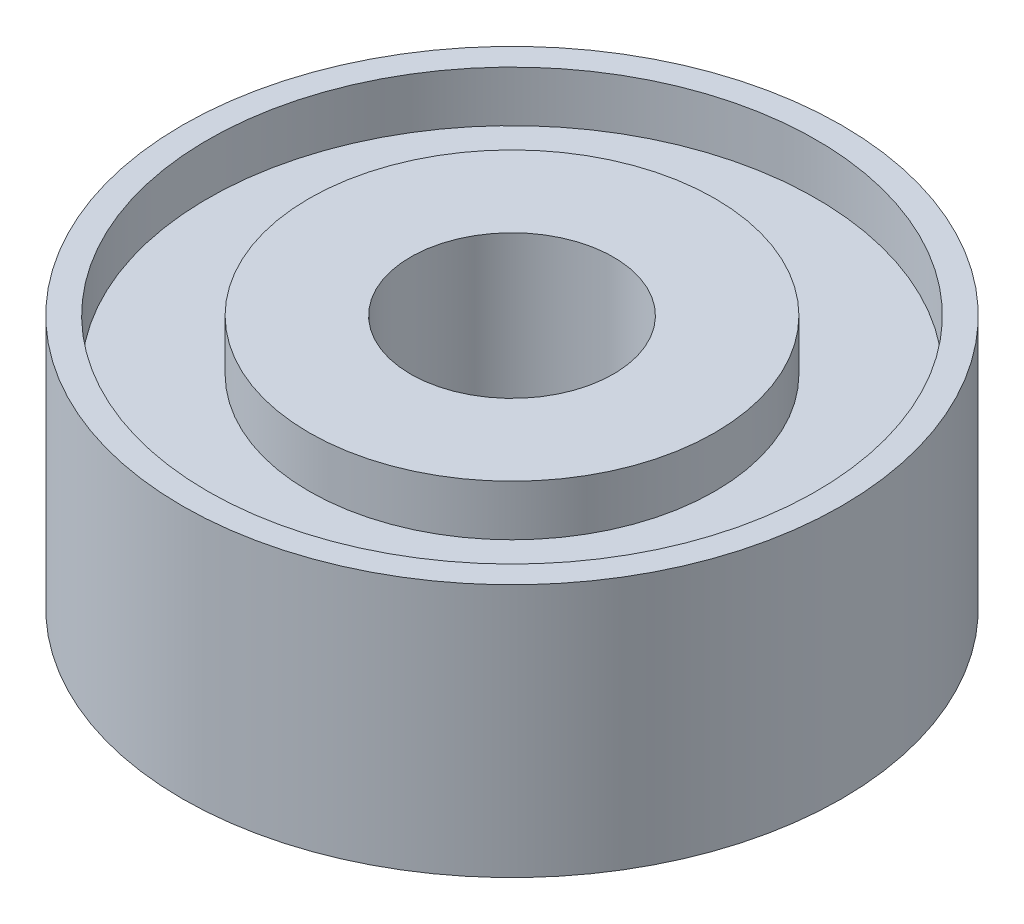
ISO-10303-21;
HEADER;
FILE_DESCRIPTION(('STEP AP214'),'2;1');
FILE_NAME('part.step','',(''),(''),'','','');
FILE_SCHEMA(('AUTOMOTIVE_DESIGN { 1 0 10303 214 1 1 1 1 }'));
ENDSEC;
DATA;
#1=APPLICATION_CONTEXT('core data for automotive mechanical design processes');
#2=APPLICATION_PROTOCOL_DEFINITION('international standard','automotive_design',2000,#1);
#3=PRODUCT_CONTEXT('',#1,'mechanical');
#4=PRODUCT('Part','Part','',(#3));
#5=PRODUCT_RELATED_PRODUCT_CATEGORY('part','',(#4));
#6=PRODUCT_DEFINITION_FORMATION('','',#4);
#7=PRODUCT_DEFINITION_CONTEXT('part definition',#1,'design');
#8=PRODUCT_DEFINITION('design','',#6,#7);
#9=PRODUCT_DEFINITION_SHAPE('','',#8);
#10=(LENGTH_UNIT() NAMED_UNIT(*) SI_UNIT(.MILLI.,.METRE.));
#11=(NAMED_UNIT(*) PLANE_ANGLE_UNIT() SI_UNIT($,.RADIAN.));
#12=(NAMED_UNIT(*) SI_UNIT($,.STERADIAN.) SOLID_ANGLE_UNIT());
#13=UNCERTAINTY_MEASURE_WITH_UNIT(LENGTH_MEASURE(1.E-05),#10,'distance_accuracy_value','');
#14=(GEOMETRIC_REPRESENTATION_CONTEXT(3) GLOBAL_UNCERTAINTY_ASSIGNED_CONTEXT((#13)) GLOBAL_UNIT_ASSIGNED_CONTEXT((#10,
#11,#12)) REPRESENTATION_CONTEXT('',''));
#15=CARTESIAN_POINT('',(0.,0.,0.));
#16=DIRECTION('',(0.,0.,1.));
#17=DIRECTION('',(1.,0.,0.));
#18=AXIS2_PLACEMENT_3D('',#15,#16,#17);
#19=CARTESIAN_POINT('',(0.,0.,0.));
#20=DIRECTION('',(0.,1.,0.));
#21=DIRECTION('',(0.,0.,1.));
#22=AXIS2_PLACEMENT_3D('',#19,#20,#21);
#23=PLANE('',#22);
#24=CARTESIAN_POINT('',(0.,0.,0.));
#25=DIRECTION('',(0.,1.,0.));
#26=DIRECTION('',(0.,0.,1.));
#27=AXIS2_PLACEMENT_3D('',#24,#25,#26);
#28=CIRCLE('',#27,2.);
#29=CARTESIAN_POINT('',(0.,0.,2.));
#30=VERTEX_POINT('',#29);
#31=EDGE_CURVE('E44',#30,#30,#28,.T.);
#32=ORIENTED_EDGE('',*,*,#31,.T.);
#33=EDGE_LOOP('',(#32));
#34=FACE_BOUND('',#33,.T.);
#35=CARTESIAN_POINT('',(0.,0.,0.));
#36=DIRECTION('',(0.,-1.,0.));
#37=DIRECTION('',(0.,0.,-1.));
#38=AXIS2_PLACEMENT_3D('',#35,#36,#37);
#39=CIRCLE('',#38,4.);
#40=CARTESIAN_POINT('',(0.,0.,-4.));
#41=VERTEX_POINT('',#40);
#42=EDGE_CURVE('E68',#41,#41,#39,.T.);
#43=ORIENTED_EDGE('',*,*,#42,.T.);
#44=EDGE_LOOP('',(#43));
#45=FACE_BOUND('',#44,.T.);
#46=ADVANCED_FACE('F31',(#34,#45),#23,.F.);
#47=CARTESIAN_POINT('',(0.,5.,0.));
#48=DIRECTION('',(0.,1.,0.));
#49=DIRECTION('',(0.,0.,1.));
#50=AXIS2_PLACEMENT_3D('',#47,#48,#49);
#51=PLANE('',#50);
#52=CARTESIAN_POINT('',(0.,5.,0.));
#53=DIRECTION('',(0.,1.,0.));
#54=DIRECTION('',(0.,0.,1.));
#55=AXIS2_PLACEMENT_3D('',#52,#53,#54);
#56=CIRCLE('',#55,2.);
#57=CARTESIAN_POINT('',(0.,5.,2.));
#58=VERTEX_POINT('',#57);
#59=EDGE_CURVE('E42',#58,#58,#56,.T.);
#60=ORIENTED_EDGE('',*,*,#59,.F.);
#61=EDGE_LOOP('',(#60));
#62=FACE_BOUND('',#61,.T.);
#63=CARTESIAN_POINT('',(0.,5.,0.));
#64=DIRECTION('',(0.,1.,0.));
#65=DIRECTION('',(0.,0.,1.));
#66=AXIS2_PLACEMENT_3D('',#63,#64,#65);
#67=CIRCLE('',#66,4.);
#68=CARTESIAN_POINT('',(0.,5.,4.));
#69=VERTEX_POINT('',#68);
#70=EDGE_CURVE('E56',#69,#69,#67,.T.);
#71=ORIENTED_EDGE('',*,*,#70,.T.);
#72=EDGE_LOOP('',(#71));
#73=FACE_BOUND('',#72,.T.);
#74=ADVANCED_FACE('F106',(#62,#73),#51,.T.);
#75=CARTESIAN_POINT('',(0.,5.,0.));
#76=DIRECTION('',(0.,1.,0.));
#77=DIRECTION('',(0.,0.,1.));
#78=AXIS2_PLACEMENT_3D('',#75,#76,#77);
#79=CIRCLE('',#78,6.);
#80=CARTESIAN_POINT('',(0.,5.,6.));
#81=VERTEX_POINT('',#80);
#82=EDGE_CURVE('E50',#81,#81,#79,.T.);
#83=ORIENTED_EDGE('',*,*,#82,.F.);
#84=EDGE_LOOP('',(#83));
#85=FACE_BOUND('',#84,.T.);
#86=CARTESIAN_POINT('',(0.,5.,0.));
#87=DIRECTION('',(0.,1.,0.));
#88=DIRECTION('',(0.,0.,1.));
#89=AXIS2_PLACEMENT_3D('',#86,#87,#88);
#90=CIRCLE('',#89,6.5);
#91=CARTESIAN_POINT('',(0.,5.,6.5));
#92=VERTEX_POINT('',#91);
#93=EDGE_CURVE('E10',#92,#92,#90,.T.);
#94=ORIENTED_EDGE('',*,*,#93,.T.);
#95=EDGE_LOOP('',(#94));
#96=FACE_BOUND('',#95,.T.);
#97=ADVANCED_FACE('F93',(#85,#96),#51,.T.);
#98=CARTESIAN_POINT('',(0.,0.,0.));
#99=DIRECTION('',(0.,-1.,0.));
#100=DIRECTION('',(0.,0.,-1.));
#101=AXIS2_PLACEMENT_3D('',#98,#99,#100);
#102=CIRCLE('',#101,6.);
#103=CARTESIAN_POINT('',(0.,0.,-6.));
#104=VERTEX_POINT('',#103);
#105=EDGE_CURVE('E62',#104,#104,#102,.T.);
#106=ORIENTED_EDGE('',*,*,#105,.F.);
#107=EDGE_LOOP('',(#106));
#108=FACE_BOUND('',#107,.T.);
#109=CARTESIAN_POINT('',(0.,0.,0.));
#110=DIRECTION('',(0.,1.,0.));
#111=DIRECTION('',(0.,0.,1.));
#112=AXIS2_PLACEMENT_3D('',#109,#110,#111);
#113=CIRCLE('',#112,6.5);
#114=CARTESIAN_POINT('',(0.,0.,6.5));
#115=VERTEX_POINT('',#114);
#116=EDGE_CURVE('E35',#115,#115,#113,.T.);
#117=ORIENTED_EDGE('',*,*,#116,.F.);
#118=EDGE_LOOP('',(#117));
#119=FACE_BOUND('',#118,.T.);
#120=ADVANCED_FACE('F90',(#108,#119),#23,.F.);
#121=CARTESIAN_POINT('',(0.,5.,0.));
#122=DIRECTION('',(0.,-1.,0.));
#123=DIRECTION('',(0.,0.,-1.));
#124=AXIS2_PLACEMENT_3D('',#121,#122,#123);
#125=CYLINDRICAL_SURFACE('',#124,6.5);
#126=ORIENTED_EDGE('',*,*,#93,.F.);
#127=EDGE_LOOP('',(#126));
#128=FACE_BOUND('',#127,.T.);
#129=ORIENTED_EDGE('',*,*,#116,.T.);
#130=EDGE_LOOP('',(#129));
#131=FACE_BOUND('',#130,.T.);
#132=ADVANCED_FACE('F33',(#128,#131),#125,.T.);
#133=CARTESIAN_POINT('',(0.,5.,0.));
#134=DIRECTION('',(0.,-1.,0.));
#135=DIRECTION('',(0.,0.,-1.));
#136=AXIS2_PLACEMENT_3D('',#133,#134,#135);
#137=CYLINDRICAL_SURFACE('',#136,2.);
#138=ORIENTED_EDGE('',*,*,#59,.T.);
#139=EDGE_LOOP('',(#138));
#140=FACE_BOUND('',#139,.T.);
#141=ORIENTED_EDGE('',*,*,#31,.F.);
#142=EDGE_LOOP('',(#141));
#143=FACE_BOUND('',#142,.T.);
#144=ADVANCED_FACE('F97',(#140,#143),#137,.F.);
#145=CARTESIAN_POINT('',(0.,4.,0.));
#146=DIRECTION('',(0.,1.,0.));
#147=DIRECTION('',(0.,0.,1.));
#148=AXIS2_PLACEMENT_3D('',#145,#146,#147);
#149=CYLINDRICAL_SURFACE('',#148,6.);
#150=CARTESIAN_POINT('',(0.,4.,0.));
#151=DIRECTION('',(0.,1.,0.));
#152=DIRECTION('',(0.,0.,1.));
#153=AXIS2_PLACEMENT_3D('',#150,#151,#152);
#154=CIRCLE('',#153,6.);
#155=CARTESIAN_POINT('',(0.,4.,6.));
#156=VERTEX_POINT('',#155);
#157=EDGE_CURVE('E47',#156,#156,#154,.T.);
#158=ORIENTED_EDGE('',*,*,#157,.F.);
#159=EDGE_LOOP('',(#158));
#160=FACE_BOUND('',#159,.T.);
#161=ORIENTED_EDGE('',*,*,#82,.T.);
#162=EDGE_LOOP('',(#161));
#163=FACE_BOUND('',#162,.T.);
#164=ADVANCED_FACE('F102',(#160,#163),#149,.F.);
#165=CARTESIAN_POINT('',(0.,4.,0.));
#166=DIRECTION('',(0.,1.,0.));
#167=DIRECTION('',(0.,0.,1.));
#168=AXIS2_PLACEMENT_3D('',#165,#166,#167);
#169=PLANE('',#168);
#170=CARTESIAN_POINT('',(0.,4.,0.));
#171=DIRECTION('',(0.,1.,0.));
#172=DIRECTION('',(0.,0.,1.));
#173=AXIS2_PLACEMENT_3D('',#170,#171,#172);
#174=CIRCLE('',#173,4.);
#175=CARTESIAN_POINT('',(0.,4.,4.));
#176=VERTEX_POINT('',#175);
#177=EDGE_CURVE('E53',#176,#176,#174,.T.);
#178=ORIENTED_EDGE('',*,*,#177,.F.);
#179=EDGE_LOOP('',(#178));
#180=FACE_BOUND('',#179,.T.);
#181=ORIENTED_EDGE('',*,*,#157,.T.);
#182=EDGE_LOOP('',(#181));
#183=FACE_BOUND('',#182,.T.);
#184=ADVANCED_FACE('F119',(#180,#183),#169,.T.);
#185=CARTESIAN_POINT('',(0.,4.,0.));
#186=DIRECTION('',(0.,1.,0.));
#187=DIRECTION('',(0.,0.,1.));
#188=AXIS2_PLACEMENT_3D('',#185,#186,#187);
#189=CYLINDRICAL_SURFACE('',#188,4.);
#190=ORIENTED_EDGE('',*,*,#177,.T.);
#191=EDGE_LOOP('',(#190));
#192=FACE_BOUND('',#191,.T.);
#193=ORIENTED_EDGE('',*,*,#70,.F.);
#194=EDGE_LOOP('',(#193));
#195=FACE_BOUND('',#194,.T.);
#196=ADVANCED_FACE('F86',(#192,#195),#189,.T.);
#197=CARTESIAN_POINT('',(0.,1.,0.));
#198=DIRECTION('',(0.,-1.,0.));
#199=DIRECTION('',(0.,0.,-1.));
#200=AXIS2_PLACEMENT_3D('',#197,#198,#199);
#201=CYLINDRICAL_SURFACE('',#200,6.);
#202=CARTESIAN_POINT('',(0.,1.,0.));
#203=DIRECTION('',(0.,-1.,0.));
#204=DIRECTION('',(0.,0.,-1.));
#205=AXIS2_PLACEMENT_3D('',#202,#203,#204);
#206=CIRCLE('',#205,6.);
#207=CARTESIAN_POINT('',(0.,1.,-6.));
#208=VERTEX_POINT('',#207);
#209=EDGE_CURVE('E59',#208,#208,#206,.T.);
#210=ORIENTED_EDGE('',*,*,#209,.F.);
#211=EDGE_LOOP('',(#210));
#212=FACE_BOUND('',#211,.T.);
#213=ORIENTED_EDGE('',*,*,#105,.T.);
#214=EDGE_LOOP('',(#213));
#215=FACE_BOUND('',#214,.T.);
#216=ADVANCED_FACE('F80',(#212,#215),#201,.F.);
#217=CARTESIAN_POINT('',(0.,1.,0.));
#218=DIRECTION('',(0.,-1.,0.));
#219=DIRECTION('',(0.,0.,-1.));
#220=AXIS2_PLACEMENT_3D('',#217,#218,#219);
#221=PLANE('',#220);
#222=CARTESIAN_POINT('',(0.,1.,0.));
#223=DIRECTION('',(0.,-1.,0.));
#224=DIRECTION('',(0.,0.,-1.));
#225=AXIS2_PLACEMENT_3D('',#222,#223,#224);
#226=CIRCLE('',#225,4.);
#227=CARTESIAN_POINT('',(0.,1.,-4.));
#228=VERTEX_POINT('',#227);
#229=EDGE_CURVE('E65',#228,#228,#226,.T.);
#230=ORIENTED_EDGE('',*,*,#229,.F.);
#231=EDGE_LOOP('',(#230));
#232=FACE_BOUND('',#231,.T.);
#233=ORIENTED_EDGE('',*,*,#209,.T.);
#234=EDGE_LOOP('',(#233));
#235=FACE_BOUND('',#234,.T.);
#236=ADVANCED_FACE('F77',(#232,#235),#221,.T.);
#237=CARTESIAN_POINT('',(0.,1.,0.));
#238=DIRECTION('',(0.,-1.,0.));
#239=DIRECTION('',(0.,0.,-1.));
#240=AXIS2_PLACEMENT_3D('',#237,#238,#239);
#241=CYLINDRICAL_SURFACE('',#240,4.);
#242=ORIENTED_EDGE('',*,*,#229,.T.);
#243=EDGE_LOOP('',(#242));
#244=FACE_BOUND('',#243,.T.);
#245=ORIENTED_EDGE('',*,*,#42,.F.);
#246=EDGE_LOOP('',(#245));
#247=FACE_BOUND('',#246,.T.);
#248=ADVANCED_FACE('F74',(#244,#247),#241,.T.);
#249=CLOSED_SHELL('',(#46,#74,#97,#120,#132,#144,#164,#184,#196,#216,#236,#248));
#250=MANIFOLD_SOLID_BREP('B2',#249);
#251=ADVANCED_BREP_SHAPE_REPRESENTATION('',(#18,#250),#14);
#252=SHAPE_DEFINITION_REPRESENTATION(#9,#251);
ENDSEC;
END-ISO-10303-21;
